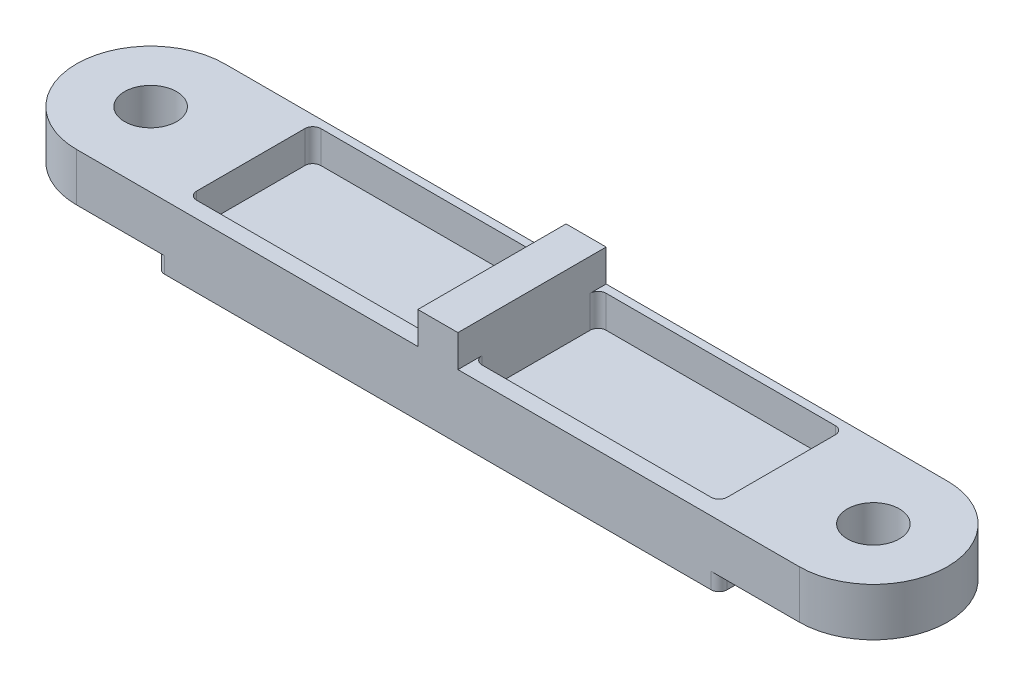
ISO-10303-21;
HEADER;
FILE_DESCRIPTION(('STEP AP214'),'2;1');
FILE_NAME('part.step','',(''),(''),'','','');
FILE_SCHEMA(('AUTOMOTIVE_DESIGN { 1 0 10303 214 1 1 1 1 }'));
ENDSEC;
DATA;
#1=APPLICATION_CONTEXT('core data for automotive mechanical design processes');
#2=APPLICATION_PROTOCOL_DEFINITION('international standard','automotive_design',2000,#1);
#3=PRODUCT_CONTEXT('',#1,'mechanical');
#4=PRODUCT('Part','Part','',(#3));
#5=PRODUCT_RELATED_PRODUCT_CATEGORY('part','',(#4));
#6=PRODUCT_DEFINITION_FORMATION('','',#4);
#7=PRODUCT_DEFINITION_CONTEXT('part definition',#1,'design');
#8=PRODUCT_DEFINITION('design','',#6,#7);
#9=PRODUCT_DEFINITION_SHAPE('','',#8);
#10=(LENGTH_UNIT() NAMED_UNIT(*) SI_UNIT(.MILLI.,.METRE.));
#11=(NAMED_UNIT(*) PLANE_ANGLE_UNIT() SI_UNIT($,.RADIAN.));
#12=(NAMED_UNIT(*) SI_UNIT($,.STERADIAN.) SOLID_ANGLE_UNIT());
#13=UNCERTAINTY_MEASURE_WITH_UNIT(LENGTH_MEASURE(1.E-05),#10,'distance_accuracy_value','');
#14=(GEOMETRIC_REPRESENTATION_CONTEXT(3) GLOBAL_UNCERTAINTY_ASSIGNED_CONTEXT((#13)) GLOBAL_UNIT_ASSIGNED_CONTEXT((#10,
#11,#12)) REPRESENTATION_CONTEXT('',''));
#15=CARTESIAN_POINT('',(0.,0.,0.));
#16=DIRECTION('',(0.,0.,1.));
#17=DIRECTION('',(1.,0.,0.));
#18=AXIS2_PLACEMENT_3D('',#15,#16,#17);
#19=CARTESIAN_POINT('',(0.,8.,0.));
#20=DIRECTION('',(0.,-1.,0.));
#21=DIRECTION('',(0.,0.,-1.));
#22=AXIS2_PLACEMENT_3D('',#19,#20,#21);
#23=PLANE('',#22);
#24=CARTESIAN_POINT('',(45.1,8.,0.));
#25=DIRECTION('',(0.,-1.,0.));
#26=DIRECTION('',(0.,0.,1.));
#27=AXIS2_PLACEMENT_3D('',#24,#25,#26);
#28=CIRCLE('',#27,3.25);
#29=CARTESIAN_POINT('',(45.1,8.,3.25000000000001));
#30=VERTEX_POINT('',#29);
#31=EDGE_CURVE('E291',#30,#30,#28,.T.);
#32=ORIENTED_EDGE('',*,*,#31,.T.);
#33=EDGE_LOOP('',(#32));
#34=FACE_BOUND('',#33,.T.);
#35=DIRECTION('',(0.,0.,-1.));
#36=VECTOR('',#35,1.);
#37=CARTESIAN_POINT('',(2.5,8.,0.));
#38=LINE('',#37,#36);
#39=CARTESIAN_POINT('',(2.5,8.,9.25));
#40=VERTEX_POINT('',#39);
#41=CARTESIAN_POINT('',(2.5,8.,6.25));
#42=VERTEX_POINT('',#41);
#43=EDGE_CURVE('E283',#40,#42,#38,.T.);
#44=ORIENTED_EDGE('',*,*,#43,.F.);
#45=DIRECTION('',(1.,0.,0.));
#46=VECTOR('',#45,1.);
#47=CARTESIAN_POINT('',(-35.1,8.,9.25));
#48=LINE('',#47,#46);
#49=CARTESIAN_POINT('',(45.1,8.,9.25));
#50=VERTEX_POINT('',#49);
#51=EDGE_CURVE('E368',#40,#50,#48,.T.);
#52=ORIENTED_EDGE('',*,*,#51,.T.);
#53=CARTESIAN_POINT('',(45.1,8.,0.));
#54=DIRECTION('',(0.,-1.,0.));
#55=DIRECTION('',(0.,0.,1.));
#56=AXIS2_PLACEMENT_3D('',#53,#54,#55);
#57=CIRCLE('',#56,9.25);
#58=CARTESIAN_POINT('',(45.1,8.,-9.24999999999999));
#59=VERTEX_POINT('',#58);
#60=EDGE_CURVE('E295',#59,#50,#57,.T.);
#61=ORIENTED_EDGE('',*,*,#60,.F.);
#62=DIRECTION('',(-1.,0.,0.));
#63=VECTOR('',#62,1.);
#64=CARTESIAN_POINT('',(-35.1,8.,-9.24999999999999));
#65=LINE('',#64,#63);
#66=CARTESIAN_POINT('',(2.5,8.,-9.25));
#67=VERTEX_POINT('',#66);
#68=EDGE_CURVE('E366',#59,#67,#65,.T.);
#69=ORIENTED_EDGE('',*,*,#68,.T.);
#70=CARTESIAN_POINT('',(2.5,8.,-7.25));
#71=VERTEX_POINT('',#70);
#72=EDGE_CURVE('E273',#71,#67,#38,.T.);
#73=ORIENTED_EDGE('',*,*,#72,.F.);
#74=CARTESIAN_POINT('',(3.5,8.,-7.25));
#75=DIRECTION('',(0.,-1.,0.));
#76=DIRECTION('',(0.,0.,-1.));
#77=AXIS2_PLACEMENT_3D('',#74,#75,#76);
#78=CIRCLE('',#77,1.);
#79=CARTESIAN_POINT('',(3.5,8.,-8.25));
#80=VERTEX_POINT('',#79);
#81=EDGE_CURVE('E463',#71,#80,#78,.T.);
#82=ORIENTED_EDGE('',*,*,#81,.T.);
#83=DIRECTION('',(-1.,0.,0.));
#84=VECTOR('',#83,1.);
#85=CARTESIAN_POINT('',(0.,8.,-8.25));
#86=LINE('',#85,#84);
#87=CARTESIAN_POINT('',(32.1,8.,-8.25));
#88=VERTEX_POINT('',#87);
#89=EDGE_CURVE('E327',#88,#80,#86,.T.);
#90=ORIENTED_EDGE('',*,*,#89,.F.);
#91=CARTESIAN_POINT('',(32.1,8.,-7.25));
#92=DIRECTION('',(0.,-1.,0.));
#93=DIRECTION('',(0.,0.,-1.));
#94=AXIS2_PLACEMENT_3D('',#91,#92,#93);
#95=CIRCLE('',#94,1.);
#96=CARTESIAN_POINT('',(33.1,8.,-7.25));
#97=VERTEX_POINT('',#96);
#98=EDGE_CURVE('E477',#88,#97,#95,.T.);
#99=ORIENTED_EDGE('',*,*,#98,.T.);
#100=DIRECTION('',(0.,0.,1.));
#101=VECTOR('',#100,1.);
#102=CARTESIAN_POINT('',(33.1,8.,7.25000000000001));
#103=LINE('',#102,#101);
#104=CARTESIAN_POINT('',(33.1,8.,6.25));
#105=VERTEX_POINT('',#104);
#106=EDGE_CURVE('E285',#97,#105,#103,.T.);
#107=ORIENTED_EDGE('',*,*,#106,.T.);
#108=CARTESIAN_POINT('',(32.1,8.,6.25));
#109=DIRECTION('',(0.,-1.,0.));
#110=DIRECTION('',(0.,0.,-1.));
#111=AXIS2_PLACEMENT_3D('',#108,#109,#110);
#112=CIRCLE('',#111,1.);
#113=CARTESIAN_POINT('',(32.1,8.,7.25));
#114=VERTEX_POINT('',#113);
#115=EDGE_CURVE('E479',#105,#114,#112,.T.);
#116=ORIENTED_EDGE('',*,*,#115,.T.);
#117=DIRECTION('',(1.,0.,0.));
#118=VECTOR('',#117,1.);
#119=CARTESIAN_POINT('',(0.,8.,7.25));
#120=LINE('',#119,#118);
#121=CARTESIAN_POINT('',(3.5,8.,7.25));
#122=VERTEX_POINT('',#121);
#123=EDGE_CURVE('E323',#122,#114,#120,.T.);
#124=ORIENTED_EDGE('',*,*,#123,.F.);
#125=CARTESIAN_POINT('',(3.5,8.,6.25));
#126=DIRECTION('',(0.,-1.,0.));
#127=DIRECTION('',(0.,0.,-1.));
#128=AXIS2_PLACEMENT_3D('',#125,#126,#127);
#129=CIRCLE('',#128,1.);
#130=EDGE_CURVE('E465',#122,#42,#129,.T.);
#131=ORIENTED_EDGE('',*,*,#130,.T.);
#132=EDGE_LOOP('',(#44,#52,#61,#69,#73,#82,#90,#99,#107,#116,#124,#131));
#133=FACE_BOUND('',#132,.T.);
#134=ADVANCED_FACE('F38',(#34,#133),#23,.F.);
#135=CARTESIAN_POINT('',(-45.1,8.,0.));
#136=DIRECTION('',(0.,1.,0.));
#137=DIRECTION('',(0.,0.,1.));
#138=AXIS2_PLACEMENT_3D('',#135,#136,#137);
#139=CIRCLE('',#138,3.25);
#140=CARTESIAN_POINT('',(-45.1,8.,3.25000000000001));
#141=VERTEX_POINT('',#140);
#142=EDGE_CURVE('E336',#141,#141,#139,.T.);
#143=ORIENTED_EDGE('',*,*,#142,.F.);
#144=EDGE_LOOP('',(#143));
#145=FACE_BOUND('',#144,.T.);
#146=DIRECTION('',(0.,0.,1.));
#147=VECTOR('',#146,1.);
#148=CARTESIAN_POINT('',(-2.5,8.,0.));
#149=LINE('',#148,#147);
#150=CARTESIAN_POINT('',(-2.5,8.,-9.25));
#151=VERTEX_POINT('',#150);
#152=CARTESIAN_POINT('',(-2.5,8.,-7.25));
#153=VERTEX_POINT('',#152);
#154=EDGE_CURVE('E277',#151,#153,#149,.T.);
#155=ORIENTED_EDGE('',*,*,#154,.F.);
#156=CARTESIAN_POINT('',(-45.1,8.,-9.24999999999999));
#157=VERTEX_POINT('',#156);
#158=EDGE_CURVE('E369',#151,#157,#65,.T.);
#159=ORIENTED_EDGE('',*,*,#158,.T.);
#160=CARTESIAN_POINT('',(-45.1,8.,0.));
#161=DIRECTION('',(0.,1.,0.));
#162=DIRECTION('',(0.,0.,1.));
#163=AXIS2_PLACEMENT_3D('',#160,#161,#162);
#164=CIRCLE('',#163,9.25);
#165=CARTESIAN_POINT('',(-45.1,8.,9.25));
#166=VERTEX_POINT('',#165);
#167=EDGE_CURVE('E344',#157,#166,#164,.T.);
#168=ORIENTED_EDGE('',*,*,#167,.T.);
#169=CARTESIAN_POINT('',(-2.5,8.,9.25));
#170=VERTEX_POINT('',#169);
#171=EDGE_CURVE('E370',#166,#170,#48,.T.);
#172=ORIENTED_EDGE('',*,*,#171,.T.);
#173=CARTESIAN_POINT('',(-2.5,8.,6.25));
#174=VERTEX_POINT('',#173);
#175=EDGE_CURVE('E274',#174,#170,#149,.T.);
#176=ORIENTED_EDGE('',*,*,#175,.F.);
#177=CARTESIAN_POINT('',(-3.5,8.,6.25));
#178=DIRECTION('',(0.,-1.,0.));
#179=DIRECTION('',(0.,0.,-1.));
#180=AXIS2_PLACEMENT_3D('',#177,#178,#179);
#181=CIRCLE('',#180,1.);
#182=CARTESIAN_POINT('',(-3.5,8.,7.25));
#183=VERTEX_POINT('',#182);
#184=EDGE_CURVE('E468',#174,#183,#181,.T.);
#185=ORIENTED_EDGE('',*,*,#184,.T.);
#186=CARTESIAN_POINT('',(-32.1,8.,7.25000000000001));
#187=VERTEX_POINT('',#186);
#188=EDGE_CURVE('E319',#187,#183,#120,.T.);
#189=ORIENTED_EDGE('',*,*,#188,.F.);
#190=CARTESIAN_POINT('',(-32.1,8.,6.25000000000001));
#191=DIRECTION('',(0.,-1.,0.));
#192=DIRECTION('',(0.,0.,-1.));
#193=AXIS2_PLACEMENT_3D('',#190,#191,#192);
#194=CIRCLE('',#193,1.);
#195=CARTESIAN_POINT('',(-33.1,8.,6.25000000000001));
#196=VERTEX_POINT('',#195);
#197=EDGE_CURVE('E473',#187,#196,#194,.T.);
#198=ORIENTED_EDGE('',*,*,#197,.T.);
#199=DIRECTION('',(0.,0.,1.));
#200=VECTOR('',#199,1.);
#201=CARTESIAN_POINT('',(-33.1,8.,7.25000000000001));
#202=LINE('',#201,#200);
#203=CARTESIAN_POINT('',(-33.1,8.,-7.25));
#204=VERTEX_POINT('',#203);
#205=EDGE_CURVE('E324',#204,#196,#202,.T.);
#206=ORIENTED_EDGE('',*,*,#205,.F.);
#207=CARTESIAN_POINT('',(-32.1,8.,-7.25));
#208=DIRECTION('',(0.,-1.,0.));
#209=DIRECTION('',(0.,0.,-1.));
#210=AXIS2_PLACEMENT_3D('',#207,#208,#209);
#211=CIRCLE('',#210,1.);
#212=CARTESIAN_POINT('',(-32.1,8.,-8.25));
#213=VERTEX_POINT('',#212);
#214=EDGE_CURVE('E475',#204,#213,#211,.T.);
#215=ORIENTED_EDGE('',*,*,#214,.T.);
#216=CARTESIAN_POINT('',(-3.5,8.,-8.25));
#217=VERTEX_POINT('',#216);
#218=EDGE_CURVE('E318',#217,#213,#86,.T.);
#219=ORIENTED_EDGE('',*,*,#218,.F.);
#220=CARTESIAN_POINT('',(-3.5,8.,-7.25));
#221=DIRECTION('',(0.,-1.,0.));
#222=DIRECTION('',(0.,0.,-1.));
#223=AXIS2_PLACEMENT_3D('',#220,#221,#222);
#224=CIRCLE('',#223,1.);
#225=EDGE_CURVE('E470',#217,#153,#224,.T.);
#226=ORIENTED_EDGE('',*,*,#225,.T.);
#227=EDGE_LOOP('',(#155,#159,#168,#172,#176,#185,#189,#198,#206,#215,#219,#226));
#228=FACE_BOUND('',#227,.T.);
#229=ADVANCED_FACE('F532',(#145,#228),#23,.F.);
#230=CARTESIAN_POINT('',(0.,4.,0.));
#231=DIRECTION('',(0.,-1.,0.));
#232=DIRECTION('',(0.,0.,-1.));
#233=AXIS2_PLACEMENT_3D('',#230,#231,#232);
#234=PLANE('',#233);
#235=DIRECTION('',(-1.,0.,0.));
#236=VECTOR('',#235,1.);
#237=CARTESIAN_POINT('',(0.,4.,-8.25));
#238=LINE('',#237,#236);
#239=CARTESIAN_POINT('',(32.1,4.,-8.25));
#240=VERTEX_POINT('',#239);
#241=CARTESIAN_POINT('',(3.5,4.,-8.25));
#242=VERTEX_POINT('',#241);
#243=EDGE_CURVE('E332',#240,#242,#238,.T.);
#244=ORIENTED_EDGE('',*,*,#243,.T.);
#245=CARTESIAN_POINT('',(3.5,4.,-7.25));
#246=DIRECTION('',(0.,-1.,0.));
#247=DIRECTION('',(0.,0.,-1.));
#248=AXIS2_PLACEMENT_3D('',#245,#246,#247);
#249=CIRCLE('',#248,1.);
#250=CARTESIAN_POINT('',(2.5,4.,-7.25));
#251=VERTEX_POINT('',#250);
#252=EDGE_CURVE('E396',#242,#251,#249,.F.);
#253=ORIENTED_EDGE('',*,*,#252,.T.);
#254=DIRECTION('',(0.,0.,-1.));
#255=VECTOR('',#254,1.);
#256=CARTESIAN_POINT('',(2.5,4.,9.25));
#257=LINE('',#256,#255);
#258=CARTESIAN_POINT('',(2.5,4.,6.25));
#259=VERTEX_POINT('',#258);
#260=EDGE_CURVE('E566',#259,#251,#257,.T.);
#261=ORIENTED_EDGE('',*,*,#260,.F.);
#262=CARTESIAN_POINT('',(3.5,4.,6.25));
#263=DIRECTION('',(0.,-1.,0.));
#264=DIRECTION('',(0.,0.,-1.));
#265=AXIS2_PLACEMENT_3D('',#262,#263,#264);
#266=CIRCLE('',#265,1.);
#267=CARTESIAN_POINT('',(3.5,4.,7.25));
#268=VERTEX_POINT('',#267);
#269=EDGE_CURVE('E394',#259,#268,#266,.F.);
#270=ORIENTED_EDGE('',*,*,#269,.T.);
#271=DIRECTION('',(1.,0.,0.));
#272=VECTOR('',#271,1.);
#273=CARTESIAN_POINT('',(0.,4.,7.25));
#274=LINE('',#273,#272);
#275=CARTESIAN_POINT('',(32.1,4.,7.25));
#276=VERTEX_POINT('',#275);
#277=EDGE_CURVE('E337',#268,#276,#274,.T.);
#278=ORIENTED_EDGE('',*,*,#277,.T.);
#279=CARTESIAN_POINT('',(32.1,4.,6.25));
#280=DIRECTION('',(0.,-1.,0.));
#281=DIRECTION('',(0.,0.,-1.));
#282=AXIS2_PLACEMENT_3D('',#279,#280,#281);
#283=CIRCLE('',#282,1.);
#284=CARTESIAN_POINT('',(33.1,4.,6.25));
#285=VERTEX_POINT('',#284);
#286=EDGE_CURVE('E390',#276,#285,#283,.F.);
#287=ORIENTED_EDGE('',*,*,#286,.T.);
#288=DIRECTION('',(0.,0.,1.));
#289=VECTOR('',#288,1.);
#290=CARTESIAN_POINT('',(33.1,4.,7.25000000000001));
#291=LINE('',#290,#289);
#292=CARTESIAN_POINT('',(33.1,4.,-7.25));
#293=VERTEX_POINT('',#292);
#294=EDGE_CURVE('E288',#293,#285,#291,.T.);
#295=ORIENTED_EDGE('',*,*,#294,.F.);
#296=CARTESIAN_POINT('',(32.1,4.,-7.25));
#297=DIRECTION('',(0.,-1.,0.));
#298=DIRECTION('',(0.,0.,-1.));
#299=AXIS2_PLACEMENT_3D('',#296,#297,#298);
#300=CIRCLE('',#299,1.);
#301=EDGE_CURVE('E392',#293,#240,#300,.F.);
#302=ORIENTED_EDGE('',*,*,#301,.T.);
#303=EDGE_LOOP('',(#244,#253,#261,#270,#278,#287,#295,#302));
#304=FACE_BOUND('',#303,.T.);
#305=ADVANCED_FACE('F538',(#304),#234,.F.);
#306=CARTESIAN_POINT('',(-32.1,4.,7.25000000000001));
#307=VERTEX_POINT('',#306);
#308=CARTESIAN_POINT('',(-3.5,4.,7.25));
#309=VERTEX_POINT('',#308);
#310=EDGE_CURVE('E333',#307,#309,#274,.T.);
#311=ORIENTED_EDGE('',*,*,#310,.T.);
#312=CARTESIAN_POINT('',(-3.5,4.,6.25));
#313=DIRECTION('',(0.,-1.,0.));
#314=DIRECTION('',(0.,0.,-1.));
#315=AXIS2_PLACEMENT_3D('',#312,#313,#314);
#316=CIRCLE('',#315,1.);
#317=CARTESIAN_POINT('',(-2.5,4.,6.25));
#318=VERTEX_POINT('',#317);
#319=EDGE_CURVE('E419',#309,#318,#316,.F.);
#320=ORIENTED_EDGE('',*,*,#319,.T.);
#321=DIRECTION('',(0.,0.,1.));
#322=VECTOR('',#321,1.);
#323=CARTESIAN_POINT('',(-2.5,4.,9.25));
#324=LINE('',#323,#322);
#325=CARTESIAN_POINT('',(-2.5,4.,-7.25));
#326=VERTEX_POINT('',#325);
#327=EDGE_CURVE('E267',#326,#318,#324,.T.);
#328=ORIENTED_EDGE('',*,*,#327,.F.);
#329=CARTESIAN_POINT('',(-3.5,4.,-7.25));
#330=DIRECTION('',(0.,-1.,0.));
#331=DIRECTION('',(0.,0.,-1.));
#332=AXIS2_PLACEMENT_3D('',#329,#330,#331);
#333=CIRCLE('',#332,1.);
#334=CARTESIAN_POINT('',(-3.5,4.,-8.25));
#335=VERTEX_POINT('',#334);
#336=EDGE_CURVE('E417',#326,#335,#333,.F.);
#337=ORIENTED_EDGE('',*,*,#336,.T.);
#338=CARTESIAN_POINT('',(-32.1,4.,-8.25));
#339=VERTEX_POINT('',#338);
#340=EDGE_CURVE('E322',#335,#339,#238,.T.);
#341=ORIENTED_EDGE('',*,*,#340,.T.);
#342=CARTESIAN_POINT('',(-32.1,4.,-7.25));
#343=DIRECTION('',(0.,-1.,0.));
#344=DIRECTION('',(0.,0.,-1.));
#345=AXIS2_PLACEMENT_3D('',#342,#343,#344);
#346=CIRCLE('',#345,1.);
#347=CARTESIAN_POINT('',(-33.1,4.,-7.25));
#348=VERTEX_POINT('',#347);
#349=EDGE_CURVE('E413',#339,#348,#346,.F.);
#350=ORIENTED_EDGE('',*,*,#349,.T.);
#351=DIRECTION('',(0.,0.,1.));
#352=VECTOR('',#351,1.);
#353=CARTESIAN_POINT('',(-33.1,4.,7.25000000000001));
#354=LINE('',#353,#352);
#355=CARTESIAN_POINT('',(-33.1,4.,6.25000000000001));
#356=VERTEX_POINT('',#355);
#357=EDGE_CURVE('E338',#348,#356,#354,.T.);
#358=ORIENTED_EDGE('',*,*,#357,.T.);
#359=CARTESIAN_POINT('',(-32.1,4.,6.25000000000001));
#360=DIRECTION('',(0.,-1.,0.));
#361=DIRECTION('',(0.,0.,-1.));
#362=AXIS2_PLACEMENT_3D('',#359,#360,#361);
#363=CIRCLE('',#362,1.);
#364=EDGE_CURVE('E415',#356,#307,#363,.F.);
#365=ORIENTED_EDGE('',*,*,#364,.T.);
#366=EDGE_LOOP('',(#311,#320,#328,#337,#341,#350,#358,#365));
#367=FACE_BOUND('',#366,.T.);
#368=ADVANCED_FACE('F634',(#367),#234,.F.);
#369=CARTESIAN_POINT('',(0.,-36.549418600027,-8.25));
#370=DIRECTION('',(0.,0.,-1.));
#371=DIRECTION('',(-1.,0.,0.));
#372=AXIS2_PLACEMENT_3D('',#369,#370,#371);
#373=PLANE('',#372);
#374=ORIENTED_EDGE('',*,*,#89,.T.);
#375=DIRECTION('',(0.,1.,0.));
#376=VECTOR('',#375,1.);
#377=CARTESIAN_POINT('',(3.5,4.,-8.25));
#378=LINE('',#377,#376);
#379=EDGE_CURVE('E388',#80,#242,#378,.F.);
#380=ORIENTED_EDGE('',*,*,#379,.T.);
#381=ORIENTED_EDGE('',*,*,#243,.F.);
#382=DIRECTION('',(0.,1.,0.));
#383=VECTOR('',#382,1.);
#384=CARTESIAN_POINT('',(32.1,8.,-8.25));
#385=LINE('',#384,#383);
#386=EDGE_CURVE('E385',#240,#88,#385,.T.);
#387=ORIENTED_EDGE('',*,*,#386,.T.);
#388=EDGE_LOOP('',(#374,#380,#381,#387));
#389=FACE_BOUND('',#388,.T.);
#390=ADVANCED_FACE('F602',(#389),#373,.F.);
#391=ORIENTED_EDGE('',*,*,#340,.F.);
#392=DIRECTION('',(0.,-1.,0.));
#393=VECTOR('',#392,1.);
#394=CARTESIAN_POINT('',(-3.5,8.,-8.25));
#395=LINE('',#394,#393);
#396=EDGE_CURVE('E423',#335,#217,#395,.F.);
#397=ORIENTED_EDGE('',*,*,#396,.T.);
#398=ORIENTED_EDGE('',*,*,#218,.T.);
#399=DIRECTION('',(0.,1.,0.));
#400=VECTOR('',#399,1.);
#401=CARTESIAN_POINT('',(-32.1,4.,-8.25));
#402=LINE('',#401,#400);
#403=EDGE_CURVE('E421',#213,#339,#402,.F.);
#404=ORIENTED_EDGE('',*,*,#403,.T.);
#405=EDGE_LOOP('',(#391,#397,#398,#404));
#406=FACE_BOUND('',#405,.T.);
#407=ADVANCED_FACE('F628',(#406),#373,.F.);
#408=CARTESIAN_POINT('',(0.,-36.549418600027,7.25));
#409=DIRECTION('',(0.,0.,1.));
#410=DIRECTION('',(1.,0.,0.));
#411=AXIS2_PLACEMENT_3D('',#408,#409,#410);
#412=PLANE('',#411);
#413=ORIENTED_EDGE('',*,*,#277,.F.);
#414=DIRECTION('',(0.,-1.,0.));
#415=VECTOR('',#414,1.);
#416=CARTESIAN_POINT('',(3.5,8.,7.25));
#417=LINE('',#416,#415);
#418=EDGE_CURVE('E400',#268,#122,#417,.F.);
#419=ORIENTED_EDGE('',*,*,#418,.T.);
#420=ORIENTED_EDGE('',*,*,#123,.T.);
#421=DIRECTION('',(0.,1.,0.));
#422=VECTOR('',#421,1.);
#423=CARTESIAN_POINT('',(32.1,4.,7.25));
#424=LINE('',#423,#422);
#425=EDGE_CURVE('E398',#114,#276,#424,.F.);
#426=ORIENTED_EDGE('',*,*,#425,.T.);
#427=EDGE_LOOP('',(#413,#419,#420,#426));
#428=FACE_BOUND('',#427,.T.);
#429=ADVANCED_FACE('F584',(#428),#412,.F.);
#430=ORIENTED_EDGE('',*,*,#188,.T.);
#431=DIRECTION('',(0.,1.,0.));
#432=VECTOR('',#431,1.);
#433=CARTESIAN_POINT('',(-3.5,4.,7.25));
#434=LINE('',#433,#432);
#435=EDGE_CURVE('E411',#183,#309,#434,.F.);
#436=ORIENTED_EDGE('',*,*,#435,.T.);
#437=ORIENTED_EDGE('',*,*,#310,.F.);
#438=DIRECTION('',(0.,1.,0.));
#439=VECTOR('',#438,1.);
#440=CARTESIAN_POINT('',(-32.1,8.,7.25000000000001));
#441=LINE('',#440,#439);
#442=EDGE_CURVE('E408',#307,#187,#441,.T.);
#443=ORIENTED_EDGE('',*,*,#442,.T.);
#444=EDGE_LOOP('',(#430,#436,#437,#443));
#445=FACE_BOUND('',#444,.T.);
#446=ADVANCED_FACE('F529',(#445),#412,.F.);
#447=CARTESIAN_POINT('',(-35.1,8.,-9.24999999999999));
#448=DIRECTION('',(0.,0.,1.));
#449=DIRECTION('',(1.,0.,0.));
#450=AXIS2_PLACEMENT_3D('',#447,#448,#449);
#451=PLANE('',#450);
#452=DIRECTION('',(1.,0.,0.));
#453=VECTOR('',#452,1.);
#454=CARTESIAN_POINT('',(35.1,2.,-9.24999999999999));
#455=LINE('',#454,#453);
#456=CARTESIAN_POINT('',(34.1,2.,-9.24999999999999));
#457=VERTEX_POINT('',#456);
#458=CARTESIAN_POINT('',(45.1,2.,-9.24999999999999));
#459=VERTEX_POINT('',#458);
#460=EDGE_CURVE('E301',#457,#459,#455,.T.);
#461=ORIENTED_EDGE('',*,*,#460,.F.);
#462=DIRECTION('',(0.,-1.,0.));
#463=VECTOR('',#462,1.);
#464=CARTESIAN_POINT('',(34.1,8.,-9.25000000000001));
#465=LINE('',#464,#463);
#466=CARTESIAN_POINT('',(34.1,0.,-9.25000000000001));
#467=VERTEX_POINT('',#466);
#468=EDGE_CURVE('E438',#457,#467,#465,.T.);
#469=ORIENTED_EDGE('',*,*,#468,.T.);
#470=DIRECTION('',(-1.,0.,0.));
#471=VECTOR('',#470,1.);
#472=CARTESIAN_POINT('',(-35.1,0.,-9.24999999999999));
#473=LINE('',#472,#471);
#474=CARTESIAN_POINT('',(-34.1,0.,-9.24999999999999));
#475=VERTEX_POINT('',#474);
#476=EDGE_CURVE('E363',#467,#475,#473,.T.);
#477=ORIENTED_EDGE('',*,*,#476,.T.);
#478=DIRECTION('',(0.,-1.,0.));
#479=VECTOR('',#478,1.);
#480=CARTESIAN_POINT('',(-34.1,8.,-9.24999999999999));
#481=LINE('',#480,#479);
#482=CARTESIAN_POINT('',(-34.1,2.,-9.24999999999999));
#483=VERTEX_POINT('',#482);
#484=EDGE_CURVE('E435',#475,#483,#481,.F.);
#485=ORIENTED_EDGE('',*,*,#484,.T.);
#486=DIRECTION('',(-1.,0.,0.));
#487=VECTOR('',#486,1.);
#488=CARTESIAN_POINT('',(-35.1,2.,-9.24999999999999));
#489=LINE('',#488,#487);
#490=CARTESIAN_POINT('',(-45.1,2.,-9.24999999999999));
#491=VERTEX_POINT('',#490);
#492=EDGE_CURVE('E350',#483,#491,#489,.T.);
#493=ORIENTED_EDGE('',*,*,#492,.T.);
#494=DIRECTION('',(0.,1.,0.));
#495=VECTOR('',#494,1.);
#496=CARTESIAN_POINT('',(-45.1,2.,-9.24999999999999));
#497=LINE('',#496,#495);
#498=EDGE_CURVE('E357',#491,#157,#497,.T.);
#499=ORIENTED_EDGE('',*,*,#498,.T.);
#500=ORIENTED_EDGE('',*,*,#158,.F.);
#501=DIRECTION('',(0.,-1.,0.));
#502=VECTOR('',#501,1.);
#503=CARTESIAN_POINT('',(-2.5,12.,-9.24999999999999));
#504=LINE('',#503,#502);
#505=CARTESIAN_POINT('',(-2.5,12.,-9.24999999999999));
#506=VERTEX_POINT('',#505);
#507=EDGE_CURVE('E254',#506,#151,#504,.T.);
#508=ORIENTED_EDGE('',*,*,#507,.F.);
#509=DIRECTION('',(-1.,0.,0.));
#510=VECTOR('',#509,1.);
#511=CARTESIAN_POINT('',(2.5,12.,-9.24999999999999));
#512=LINE('',#511,#510);
#513=CARTESIAN_POINT('',(2.5,12.,-9.24999999999999));
#514=VERTEX_POINT('',#513);
#515=EDGE_CURVE('E247',#514,#506,#512,.T.);
#516=ORIENTED_EDGE('',*,*,#515,.F.);
#517=DIRECTION('',(0.,-1.,0.));
#518=VECTOR('',#517,1.);
#519=CARTESIAN_POINT('',(2.5,12.,-9.24999999999999));
#520=LINE('',#519,#518);
#521=EDGE_CURVE('E251',#514,#67,#520,.T.);
#522=ORIENTED_EDGE('',*,*,#521,.T.);
#523=ORIENTED_EDGE('',*,*,#68,.F.);
#524=DIRECTION('',(0.,1.,0.));
#525=VECTOR('',#524,1.);
#526=CARTESIAN_POINT('',(45.1,2.,-9.24999999999999));
#527=LINE('',#526,#525);
#528=EDGE_CURVE('E307',#459,#59,#527,.T.);
#529=ORIENTED_EDGE('',*,*,#528,.F.);
#530=EDGE_LOOP('',(#461,#469,#477,#485,#493,#499,#500,#508,#516,#522,#523,#529));
#531=FACE_BOUND('',#530,.T.);
#532=ADVANCED_FACE('F249',(#531),#451,.F.);
#533=CARTESIAN_POINT('',(-35.1,8.,9.25));
#534=DIRECTION('',(1.,0.,0.));
#535=DIRECTION('',(0.,0.,-1.));
#536=AXIS2_PLACEMENT_3D('',#533,#534,#535);
#537=PLANE('',#536);
#538=DIRECTION('',(0.,0.,-1.));
#539=VECTOR('',#538,1.);
#540=CARTESIAN_POINT('',(-35.1,2.,-9.24999999999999));
#541=LINE('',#540,#539);
#542=CARTESIAN_POINT('',(-35.1,2.,8.25));
#543=VERTEX_POINT('',#542);
#544=CARTESIAN_POINT('',(-35.1,2.,-8.24999999999999));
#545=VERTEX_POINT('',#544);
#546=EDGE_CURVE('E347',#543,#545,#541,.T.);
#547=ORIENTED_EDGE('',*,*,#546,.T.);
#548=DIRECTION('',(0.,-1.,0.));
#549=VECTOR('',#548,1.);
#550=CARTESIAN_POINT('',(-35.1,8.,-8.24999999999999));
#551=LINE('',#550,#549);
#552=CARTESIAN_POINT('',(-35.1,0.,-8.24999999999999));
#553=VERTEX_POINT('',#552);
#554=EDGE_CURVE('E456',#545,#553,#551,.T.);
#555=ORIENTED_EDGE('',*,*,#554,.T.);
#556=DIRECTION('',(0.,0.,1.));
#557=VECTOR('',#556,1.);
#558=CARTESIAN_POINT('',(-35.1,0.,9.25));
#559=LINE('',#558,#557);
#560=CARTESIAN_POINT('',(-35.1,0.,8.25));
#561=VERTEX_POINT('',#560);
#562=EDGE_CURVE('E375',#553,#561,#559,.T.);
#563=ORIENTED_EDGE('',*,*,#562,.T.);
#564=DIRECTION('',(0.,-1.,0.));
#565=VECTOR('',#564,1.);
#566=CARTESIAN_POINT('',(-35.1,8.,8.25));
#567=LINE('',#566,#565);
#568=EDGE_CURVE('E454',#561,#543,#567,.F.);
#569=ORIENTED_EDGE('',*,*,#568,.T.);
#570=EDGE_LOOP('',(#547,#555,#563,#569));
#571=FACE_BOUND('',#570,.T.);
#572=ADVANCED_FACE('F521',(#571),#537,.F.);
#573=CARTESIAN_POINT('',(-35.1,8.,9.25));
#574=DIRECTION('',(0.,0.,-1.));
#575=DIRECTION('',(-1.,0.,0.));
#576=AXIS2_PLACEMENT_3D('',#573,#574,#575);
#577=PLANE('',#576);
#578=DIRECTION('',(1.,0.,0.));
#579=VECTOR('',#578,1.);
#580=CARTESIAN_POINT('',(-35.1,2.,9.25));
#581=LINE('',#580,#579);
#582=CARTESIAN_POINT('',(-45.1,2.,9.25));
#583=VERTEX_POINT('',#582);
#584=CARTESIAN_POINT('',(-34.1,2.,9.25));
#585=VERTEX_POINT('',#584);
#586=EDGE_CURVE('E53',#583,#585,#581,.T.);
#587=ORIENTED_EDGE('',*,*,#586,.T.);
#588=DIRECTION('',(0.,-1.,0.));
#589=VECTOR('',#588,1.);
#590=CARTESIAN_POINT('',(-34.1,8.,9.25));
#591=LINE('',#590,#589);
#592=CARTESIAN_POINT('',(-34.1,0.,9.25));
#593=VERTEX_POINT('',#592);
#594=EDGE_CURVE('E461',#585,#593,#591,.T.);
#595=ORIENTED_EDGE('',*,*,#594,.T.);
#596=DIRECTION('',(1.,0.,0.));
#597=VECTOR('',#596,1.);
#598=CARTESIAN_POINT('',(-35.1,0.,9.25));
#599=LINE('',#598,#597);
#600=CARTESIAN_POINT('',(34.1,0.,9.25));
#601=VERTEX_POINT('',#600);
#602=EDGE_CURVE('E378',#593,#601,#599,.T.);
#603=ORIENTED_EDGE('',*,*,#602,.T.);
#604=DIRECTION('',(0.,-1.,0.));
#605=VECTOR('',#604,1.);
#606=CARTESIAN_POINT('',(34.1,8.,9.25));
#607=LINE('',#606,#605);
#608=CARTESIAN_POINT('',(34.1,2.,9.25));
#609=VERTEX_POINT('',#608);
#610=EDGE_CURVE('E459',#601,#609,#607,.F.);
#611=ORIENTED_EDGE('',*,*,#610,.T.);
#612=DIRECTION('',(-1.,0.,0.));
#613=VECTOR('',#612,1.);
#614=CARTESIAN_POINT('',(35.1,2.,9.25));
#615=LINE('',#614,#613);
#616=CARTESIAN_POINT('',(45.1,2.,9.25));
#617=VERTEX_POINT('',#616);
#618=EDGE_CURVE('E60',#617,#609,#615,.T.);
#619=ORIENTED_EDGE('',*,*,#618,.F.);
#620=DIRECTION('',(0.,1.,0.));
#621=VECTOR('',#620,1.);
#622=CARTESIAN_POINT('',(45.1,2.,9.25));
#623=LINE('',#622,#621);
#624=EDGE_CURVE('E310',#617,#50,#623,.T.);
#625=ORIENTED_EDGE('',*,*,#624,.T.);
#626=ORIENTED_EDGE('',*,*,#51,.F.);
#627=DIRECTION('',(0.,-1.,0.));
#628=VECTOR('',#627,1.);
#629=CARTESIAN_POINT('',(2.5,12.,9.25));
#630=LINE('',#629,#628);
#631=CARTESIAN_POINT('',(2.5,12.,9.25));
#632=VERTEX_POINT('',#631);
#633=EDGE_CURVE('E563',#632,#40,#630,.T.);
#634=ORIENTED_EDGE('',*,*,#633,.F.);
#635=DIRECTION('',(1.,0.,0.));
#636=VECTOR('',#635,1.);
#637=CARTESIAN_POINT('',(2.5,12.,9.25));
#638=LINE('',#637,#636);
#639=CARTESIAN_POINT('',(-2.5,12.,9.25));
#640=VERTEX_POINT('',#639);
#641=EDGE_CURVE('E263',#640,#632,#638,.T.);
#642=ORIENTED_EDGE('',*,*,#641,.F.);
#643=DIRECTION('',(0.,-1.,0.));
#644=VECTOR('',#643,1.);
#645=CARTESIAN_POINT('',(-2.5,12.,9.25));
#646=LINE('',#645,#644);
#647=EDGE_CURVE('E279',#640,#170,#646,.T.);
#648=ORIENTED_EDGE('',*,*,#647,.T.);
#649=ORIENTED_EDGE('',*,*,#171,.F.);
#650=DIRECTION('',(0.,1.,0.));
#651=VECTOR('',#650,1.);
#652=CARTESIAN_POINT('',(-45.1,2.,9.25));
#653=LINE('',#652,#651);
#654=EDGE_CURVE('E360',#583,#166,#653,.T.);
#655=ORIENTED_EDGE('',*,*,#654,.F.);
#656=EDGE_LOOP('',(#587,#595,#603,#611,#619,#625,#626,#634,#642,#648,#649,#655));
#657=FACE_BOUND('',#656,.T.);
#658=ADVANCED_FACE('F495',(#657),#577,.F.);
#659=CARTESIAN_POINT('',(0.,0.,0.));
#660=DIRECTION('',(0.,-1.,0.));
#661=DIRECTION('',(0.,0.,-1.));
#662=AXIS2_PLACEMENT_3D('',#659,#660,#661);
#663=PLANE('',#662);
#664=ORIENTED_EDGE('',*,*,#476,.F.);
#665=CARTESIAN_POINT('',(34.1,0.,-8.25000000000001));
#666=DIRECTION('',(0.,-1.,0.));
#667=DIRECTION('',(0.,0.,-1.));
#668=AXIS2_PLACEMENT_3D('',#665,#666,#667);
#669=CIRCLE('',#668,1.);
#670=CARTESIAN_POINT('',(35.1,0.,-8.25000000000001));
#671=VERTEX_POINT('',#670);
#672=EDGE_CURVE('E447',#467,#671,#669,.T.);
#673=ORIENTED_EDGE('',*,*,#672,.T.);
#674=DIRECTION('',(0.,0.,1.));
#675=VECTOR('',#674,1.);
#676=CARTESIAN_POINT('',(35.1,0.,9.25));
#677=LINE('',#676,#675);
#678=CARTESIAN_POINT('',(35.1,0.,8.25));
#679=VERTEX_POINT('',#678);
#680=EDGE_CURVE('E313',#671,#679,#677,.T.);
#681=ORIENTED_EDGE('',*,*,#680,.T.);
#682=CARTESIAN_POINT('',(34.1,0.,8.25));
#683=DIRECTION('',(0.,-1.,0.));
#684=DIRECTION('',(0.,0.,-1.));
#685=AXIS2_PLACEMENT_3D('',#682,#683,#684);
#686=CIRCLE('',#685,1.);
#687=EDGE_CURVE('E441',#679,#601,#686,.T.);
#688=ORIENTED_EDGE('',*,*,#687,.T.);
#689=ORIENTED_EDGE('',*,*,#602,.F.);
#690=CARTESIAN_POINT('',(-34.1,0.,8.25));
#691=DIRECTION('',(0.,-1.,0.));
#692=DIRECTION('',(0.,0.,-1.));
#693=AXIS2_PLACEMENT_3D('',#690,#691,#692);
#694=CIRCLE('',#693,1.);
#695=EDGE_CURVE('E443',#593,#561,#694,.T.);
#696=ORIENTED_EDGE('',*,*,#695,.T.);
#697=ORIENTED_EDGE('',*,*,#562,.F.);
#698=CARTESIAN_POINT('',(-34.1,0.,-8.24999999999999));
#699=DIRECTION('',(0.,-1.,0.));
#700=DIRECTION('',(0.,0.,-1.));
#701=AXIS2_PLACEMENT_3D('',#698,#699,#700);
#702=CIRCLE('',#701,1.);
#703=EDGE_CURVE('E445',#553,#475,#702,.T.);
#704=ORIENTED_EDGE('',*,*,#703,.T.);
#705=EDGE_LOOP('',(#664,#673,#681,#688,#689,#696,#697,#704));
#706=FACE_BOUND('',#705,.T.);
#707=ADVANCED_FACE('F499',(#706),#663,.T.);
#708=CARTESIAN_POINT('',(-45.1,2.,0.));
#709=DIRECTION('',(0.,1.,0.));
#710=DIRECTION('',(0.,0.,1.));
#711=AXIS2_PLACEMENT_3D('',#708,#709,#710);
#712=CYLINDRICAL_SURFACE('',#711,9.25);
#713=ORIENTED_EDGE('',*,*,#167,.F.);
#714=ORIENTED_EDGE('',*,*,#498,.F.);
#715=CARTESIAN_POINT('',(-45.1,2.,0.));
#716=DIRECTION('',(0.,1.,0.));
#717=DIRECTION('',(0.,0.,1.));
#718=AXIS2_PLACEMENT_3D('',#715,#716,#717);
#719=CIRCLE('',#718,9.25);
#720=EDGE_CURVE('E353',#491,#583,#719,.T.);
#721=ORIENTED_EDGE('',*,*,#720,.T.);
#722=ORIENTED_EDGE('',*,*,#654,.T.);
#723=EDGE_LOOP('',(#713,#714,#721,#722));
#724=FACE_BOUND('',#723,.T.);
#725=ADVANCED_FACE('F543',(#724),#712,.T.);
#726=CARTESIAN_POINT('',(-45.1,2.,0.));
#727=DIRECTION('',(0.,1.,0.));
#728=DIRECTION('',(0.,0.,1.));
#729=AXIS2_PLACEMENT_3D('',#726,#727,#728);
#730=PLANE('',#729);
#731=CARTESIAN_POINT('',(-45.1,2.,0.));
#732=DIRECTION('',(0.,1.,0.));
#733=DIRECTION('',(0.,0.,1.));
#734=AXIS2_PLACEMENT_3D('',#731,#732,#733);
#735=CIRCLE('',#734,3.25);
#736=CARTESIAN_POINT('',(-45.1,2.,3.25000000000001));
#737=VERTEX_POINT('',#736);
#738=EDGE_CURVE('E341',#737,#737,#735,.T.);
#739=ORIENTED_EDGE('',*,*,#738,.T.);
#740=EDGE_LOOP('',(#739));
#741=FACE_BOUND('',#740,.T.);
#742=ORIENTED_EDGE('',*,*,#546,.F.);
#743=CARTESIAN_POINT('',(-34.1,2.,8.25));
#744=DIRECTION('',(0.,1.,0.));
#745=DIRECTION('',(0.,0.,1.));
#746=AXIS2_PLACEMENT_3D('',#743,#744,#745);
#747=CIRCLE('',#746,1.);
#748=EDGE_CURVE('E46',#543,#585,#747,.T.);
#749=ORIENTED_EDGE('',*,*,#748,.T.);
#750=ORIENTED_EDGE('',*,*,#586,.F.);
#751=ORIENTED_EDGE('',*,*,#720,.F.);
#752=ORIENTED_EDGE('',*,*,#492,.F.);
#753=CARTESIAN_POINT('',(-34.1,2.,-8.24999999999999));
#754=DIRECTION('',(0.,1.,0.));
#755=DIRECTION('',(0.,0.,1.));
#756=AXIS2_PLACEMENT_3D('',#753,#754,#755);
#757=CIRCLE('',#756,1.);
#758=EDGE_CURVE('E484',#483,#545,#757,.T.);
#759=ORIENTED_EDGE('',*,*,#758,.T.);
#760=EDGE_LOOP('',(#742,#749,#750,#751,#752,#759));
#761=FACE_BOUND('',#760,.T.);
#762=ADVANCED_FACE('F489',(#741,#761),#730,.F.);
#763=CARTESIAN_POINT('',(-45.1,2.,0.));
#764=DIRECTION('',(0.,1.,0.));
#765=DIRECTION('',(0.,0.,1.));
#766=AXIS2_PLACEMENT_3D('',#763,#764,#765);
#767=CYLINDRICAL_SURFACE('',#766,3.25);
#768=ORIENTED_EDGE('',*,*,#738,.F.);
#769=EDGE_LOOP('',(#768));
#770=FACE_BOUND('',#769,.T.);
#771=ORIENTED_EDGE('',*,*,#142,.T.);
#772=EDGE_LOOP('',(#771));
#773=FACE_BOUND('',#772,.T.);
#774=ADVANCED_FACE('F553',(#770,#773),#767,.F.);
#775=CARTESIAN_POINT('',(-33.1,-36.549418600027,7.25000000000001));
#776=DIRECTION('',(-1.,0.,0.));
#777=DIRECTION('',(0.,0.,1.));
#778=AXIS2_PLACEMENT_3D('',#775,#776,#777);
#779=PLANE('',#778);
#780=ORIENTED_EDGE('',*,*,#205,.T.);
#781=DIRECTION('',(0.,1.,0.));
#782=VECTOR('',#781,1.);
#783=CARTESIAN_POINT('',(-33.1,4.,6.25000000000001));
#784=LINE('',#783,#782);
#785=EDGE_CURVE('E428',#196,#356,#784,.F.);
#786=ORIENTED_EDGE('',*,*,#785,.T.);
#787=ORIENTED_EDGE('',*,*,#357,.F.);
#788=DIRECTION('',(0.,1.,0.));
#789=VECTOR('',#788,1.);
#790=CARTESIAN_POINT('',(-33.1,8.,-7.25));
#791=LINE('',#790,#789);
#792=EDGE_CURVE('E425',#348,#204,#791,.T.);
#793=ORIENTED_EDGE('',*,*,#792,.T.);
#794=EDGE_LOOP('',(#780,#786,#787,#793));
#795=FACE_BOUND('',#794,.T.);
#796=ADVANCED_FACE('F622',(#795),#779,.F.);
#797=CARTESIAN_POINT('',(35.1,8.,9.25));
#798=DIRECTION('',(-1.,0.,0.));
#799=DIRECTION('',(0.,0.,-1.));
#800=AXIS2_PLACEMENT_3D('',#797,#798,#799);
#801=PLANE('',#800);
#802=ORIENTED_EDGE('',*,*,#680,.F.);
#803=DIRECTION('',(0.,-1.,0.));
#804=VECTOR('',#803,1.);
#805=CARTESIAN_POINT('',(35.1,8.,-8.25000000000001));
#806=LINE('',#805,#804);
#807=CARTESIAN_POINT('',(35.1,2.,-8.25000000000001));
#808=VERTEX_POINT('',#807);
#809=EDGE_CURVE('E452',#671,#808,#806,.F.);
#810=ORIENTED_EDGE('',*,*,#809,.T.);
#811=DIRECTION('',(0.,0.,-1.));
#812=VECTOR('',#811,1.);
#813=CARTESIAN_POINT('',(35.1,2.,-9.24999999999999));
#814=LINE('',#813,#812);
#815=CARTESIAN_POINT('',(35.1,2.,8.25));
#816=VERTEX_POINT('',#815);
#817=EDGE_CURVE('E298',#816,#808,#814,.T.);
#818=ORIENTED_EDGE('',*,*,#817,.F.);
#819=DIRECTION('',(0.,-1.,0.));
#820=VECTOR('',#819,1.);
#821=CARTESIAN_POINT('',(35.1,8.,8.25));
#822=LINE('',#821,#820);
#823=EDGE_CURVE('E449',#816,#679,#822,.T.);
#824=ORIENTED_EDGE('',*,*,#823,.T.);
#825=EDGE_LOOP('',(#802,#810,#818,#824));
#826=FACE_BOUND('',#825,.T.);
#827=ADVANCED_FACE('F507',(#826),#801,.F.);
#828=CARTESIAN_POINT('',(45.1,2.,0.));
#829=DIRECTION('',(0.,1.,0.));
#830=DIRECTION('',(0.,0.,1.));
#831=AXIS2_PLACEMENT_3D('',#828,#829,#830);
#832=CYLINDRICAL_SURFACE('',#831,9.25);
#833=ORIENTED_EDGE('',*,*,#60,.T.);
#834=ORIENTED_EDGE('',*,*,#624,.F.);
#835=CARTESIAN_POINT('',(45.1,2.,0.));
#836=DIRECTION('',(0.,-1.,0.));
#837=DIRECTION('',(0.,0.,1.));
#838=AXIS2_PLACEMENT_3D('',#835,#836,#837);
#839=CIRCLE('',#838,9.25);
#840=EDGE_CURVE('E304',#459,#617,#839,.T.);
#841=ORIENTED_EDGE('',*,*,#840,.F.);
#842=ORIENTED_EDGE('',*,*,#528,.T.);
#843=EDGE_LOOP('',(#833,#834,#841,#842));
#844=FACE_BOUND('',#843,.T.);
#845=ADVANCED_FACE('F611',(#844),#832,.T.);
#846=CARTESIAN_POINT('',(45.1,2.,0.));
#847=DIRECTION('',(0.,1.,0.));
#848=DIRECTION('',(0.,0.,1.));
#849=AXIS2_PLACEMENT_3D('',#846,#847,#848);
#850=PLANE('',#849);
#851=CARTESIAN_POINT('',(45.1,2.,0.));
#852=DIRECTION('',(0.,-1.,0.));
#853=DIRECTION('',(0.,0.,1.));
#854=AXIS2_PLACEMENT_3D('',#851,#852,#853);
#855=CIRCLE('',#854,3.25);
#856=CARTESIAN_POINT('',(45.1,2.,3.25000000000001));
#857=VERTEX_POINT('',#856);
#858=EDGE_CURVE('E292',#857,#857,#855,.T.);
#859=ORIENTED_EDGE('',*,*,#858,.F.);
#860=EDGE_LOOP('',(#859));
#861=FACE_BOUND('',#860,.T.);
#862=ORIENTED_EDGE('',*,*,#618,.T.);
#863=CARTESIAN_POINT('',(34.1,2.,8.25));
#864=DIRECTION('',(0.,1.,0.));
#865=DIRECTION('',(0.,0.,1.));
#866=AXIS2_PLACEMENT_3D('',#863,#864,#865);
#867=CIRCLE('',#866,1.);
#868=EDGE_CURVE('E13',#609,#816,#867,.T.);
#869=ORIENTED_EDGE('',*,*,#868,.T.);
#870=ORIENTED_EDGE('',*,*,#817,.T.);
#871=CARTESIAN_POINT('',(34.1,2.,-8.25000000000001));
#872=DIRECTION('',(0.,1.,0.));
#873=DIRECTION('',(0.,0.,1.));
#874=AXIS2_PLACEMENT_3D('',#871,#872,#873);
#875=CIRCLE('',#874,1.);
#876=EDGE_CURVE('E481',#808,#457,#875,.T.);
#877=ORIENTED_EDGE('',*,*,#876,.T.);
#878=ORIENTED_EDGE('',*,*,#460,.T.);
#879=ORIENTED_EDGE('',*,*,#840,.T.);
#880=EDGE_LOOP('',(#862,#869,#870,#877,#878,#879));
#881=FACE_BOUND('',#880,.T.);
#882=ADVANCED_FACE('F510',(#861,#881),#850,.F.);
#883=CARTESIAN_POINT('',(45.1,2.,0.));
#884=DIRECTION('',(0.,1.,0.));
#885=DIRECTION('',(0.,0.,1.));
#886=AXIS2_PLACEMENT_3D('',#883,#884,#885);
#887=CYLINDRICAL_SURFACE('',#886,3.25);
#888=ORIENTED_EDGE('',*,*,#858,.T.);
#889=EDGE_LOOP('',(#888));
#890=FACE_BOUND('',#889,.T.);
#891=ORIENTED_EDGE('',*,*,#31,.F.);
#892=EDGE_LOOP('',(#891));
#893=FACE_BOUND('',#892,.T.);
#894=ADVANCED_FACE('F619',(#890,#893),#887,.F.);
#895=CARTESIAN_POINT('',(33.1,-36.549418600027,7.25000000000001));
#896=DIRECTION('',(1.,0.,0.));
#897=DIRECTION('',(0.,0.,1.));
#898=AXIS2_PLACEMENT_3D('',#895,#896,#897);
#899=PLANE('',#898);
#900=ORIENTED_EDGE('',*,*,#106,.F.);
#901=DIRECTION('',(0.,1.,0.));
#902=VECTOR('',#901,1.);
#903=CARTESIAN_POINT('',(33.1,4.,-7.25));
#904=LINE('',#903,#902);
#905=EDGE_CURVE('E433',#97,#293,#904,.F.);
#906=ORIENTED_EDGE('',*,*,#905,.T.);
#907=ORIENTED_EDGE('',*,*,#294,.T.);
#908=DIRECTION('',(0.,1.,0.));
#909=VECTOR('',#908,1.);
#910=CARTESIAN_POINT('',(33.1,8.,6.25));
#911=LINE('',#910,#909);
#912=EDGE_CURVE('E430',#285,#105,#911,.T.);
#913=ORIENTED_EDGE('',*,*,#912,.T.);
#914=EDGE_LOOP('',(#900,#906,#907,#913));
#915=FACE_BOUND('',#914,.T.);
#916=ADVANCED_FACE('F593',(#915),#899,.F.);
#917=CARTESIAN_POINT('',(2.5,12.,9.25));
#918=DIRECTION('',(-1.,0.,0.));
#919=DIRECTION('',(0.,0.,1.));
#920=AXIS2_PLACEMENT_3D('',#917,#918,#919);
#921=PLANE('',#920);
#922=ORIENTED_EDGE('',*,*,#260,.T.);
#923=DIRECTION('',(0.,1.,0.));
#924=VECTOR('',#923,1.);
#925=CARTESIAN_POINT('',(2.5,8.,-7.25));
#926=LINE('',#925,#924);
#927=EDGE_CURVE('E383',#251,#71,#926,.T.);
#928=ORIENTED_EDGE('',*,*,#927,.T.);
#929=ORIENTED_EDGE('',*,*,#72,.T.);
#930=ORIENTED_EDGE('',*,*,#521,.F.);
#931=DIRECTION('',(0.,0.,-1.));
#932=VECTOR('',#931,1.);
#933=CARTESIAN_POINT('',(2.5,12.,9.25));
#934=LINE('',#933,#932);
#935=EDGE_CURVE('E258',#632,#514,#934,.T.);
#936=ORIENTED_EDGE('',*,*,#935,.F.);
#937=ORIENTED_EDGE('',*,*,#633,.T.);
#938=ORIENTED_EDGE('',*,*,#43,.T.);
#939=DIRECTION('',(0.,-1.,0.));
#940=VECTOR('',#939,1.);
#941=CARTESIAN_POINT('',(2.5,4.,6.25));
#942=LINE('',#941,#940);
#943=EDGE_CURVE('E372',#42,#259,#942,.T.);
#944=ORIENTED_EDGE('',*,*,#943,.T.);
#945=EDGE_LOOP('',(#922,#928,#929,#930,#936,#937,#938,#944));
#946=FACE_BOUND('',#945,.T.);
#947=ADVANCED_FACE('F271',(#946),#921,.F.);
#948=CARTESIAN_POINT('',(-2.5,12.,9.25));
#949=DIRECTION('',(1.,0.,0.));
#950=DIRECTION('',(0.,0.,-1.));
#951=AXIS2_PLACEMENT_3D('',#948,#949,#950);
#952=PLANE('',#951);
#953=ORIENTED_EDGE('',*,*,#327,.T.);
#954=DIRECTION('',(0.,1.,0.));
#955=VECTOR('',#954,1.);
#956=CARTESIAN_POINT('',(-2.5,8.,6.25));
#957=LINE('',#956,#955);
#958=EDGE_CURVE('E405',#318,#174,#957,.T.);
#959=ORIENTED_EDGE('',*,*,#958,.T.);
#960=ORIENTED_EDGE('',*,*,#175,.T.);
#961=ORIENTED_EDGE('',*,*,#647,.F.);
#962=DIRECTION('',(0.,0.,1.));
#963=VECTOR('',#962,1.);
#964=CARTESIAN_POINT('',(-2.5,12.,9.25));
#965=LINE('',#964,#963);
#966=EDGE_CURVE('E257',#506,#640,#965,.T.);
#967=ORIENTED_EDGE('',*,*,#966,.F.);
#968=ORIENTED_EDGE('',*,*,#507,.T.);
#969=ORIENTED_EDGE('',*,*,#154,.T.);
#970=DIRECTION('',(0.,-1.,0.));
#971=VECTOR('',#970,1.);
#972=CARTESIAN_POINT('',(-2.5,4.,-7.25));
#973=LINE('',#972,#971);
#974=EDGE_CURVE('E402',#153,#326,#973,.T.);
#975=ORIENTED_EDGE('',*,*,#974,.T.);
#976=EDGE_LOOP('',(#953,#959,#960,#961,#967,#968,#969,#975));
#977=FACE_BOUND('',#976,.T.);
#978=ADVANCED_FACE('F559',(#977),#952,.F.);
#979=CARTESIAN_POINT('',(0.,12.,0.));
#980=DIRECTION('',(0.,1.,0.));
#981=DIRECTION('',(0.,0.,1.));
#982=AXIS2_PLACEMENT_3D('',#979,#980,#981);
#983=PLANE('',#982);
#984=ORIENTED_EDGE('',*,*,#935,.T.);
#985=ORIENTED_EDGE('',*,*,#515,.T.);
#986=ORIENTED_EDGE('',*,*,#966,.T.);
#987=ORIENTED_EDGE('',*,*,#641,.T.);
#988=EDGE_LOOP('',(#984,#985,#986,#987));
#989=FACE_BOUND('',#988,.T.);
#990=ADVANCED_FACE('F261',(#989),#983,.T.);
#991=CARTESIAN_POINT('',(3.5,12.,-7.25));
#992=DIRECTION('',(0.,-1.,0.));
#993=DIRECTION('',(0.,0.,-1.));
#994=AXIS2_PLACEMENT_3D('',#991,#992,#993);
#995=CYLINDRICAL_SURFACE('',#994,1.);
#996=ORIENTED_EDGE('',*,*,#252,.F.);
#997=ORIENTED_EDGE('',*,*,#379,.F.);
#998=ORIENTED_EDGE('',*,*,#81,.F.);
#999=ORIENTED_EDGE('',*,*,#927,.F.);
#1000=EDGE_LOOP('',(#996,#997,#998,#999));
#1001=FACE_BOUND('',#1000,.T.);
#1002=ADVANCED_FACE('F607',(#1001),#995,.F.);
#1003=CARTESIAN_POINT('',(3.5,12.,6.25));
#1004=DIRECTION('',(0.,1.,0.));
#1005=DIRECTION('',(0.,0.,1.));
#1006=AXIS2_PLACEMENT_3D('',#1003,#1004,#1005);
#1007=CYLINDRICAL_SURFACE('',#1006,1.);
#1008=ORIENTED_EDGE('',*,*,#130,.F.);
#1009=ORIENTED_EDGE('',*,*,#418,.F.);
#1010=ORIENTED_EDGE('',*,*,#269,.F.);
#1011=ORIENTED_EDGE('',*,*,#943,.F.);
#1012=EDGE_LOOP('',(#1008,#1009,#1010,#1011));
#1013=FACE_BOUND('',#1012,.T.);
#1014=ADVANCED_FACE('F577',(#1013),#1007,.F.);
#1015=CARTESIAN_POINT('',(-3.5,12.,6.25));
#1016=DIRECTION('',(0.,-1.,0.));
#1017=DIRECTION('',(0.,0.,-1.));
#1018=AXIS2_PLACEMENT_3D('',#1015,#1016,#1017);
#1019=CYLINDRICAL_SURFACE('',#1018,1.);
#1020=ORIENTED_EDGE('',*,*,#319,.F.);
#1021=ORIENTED_EDGE('',*,*,#435,.F.);
#1022=ORIENTED_EDGE('',*,*,#184,.F.);
#1023=ORIENTED_EDGE('',*,*,#958,.F.);
#1024=EDGE_LOOP('',(#1020,#1021,#1022,#1023));
#1025=FACE_BOUND('',#1024,.T.);
#1026=ADVANCED_FACE('F711',(#1025),#1019,.F.);
#1027=CARTESIAN_POINT('',(-3.5,12.,-7.25));
#1028=DIRECTION('',(0.,1.,0.));
#1029=DIRECTION('',(0.,0.,1.));
#1030=AXIS2_PLACEMENT_3D('',#1027,#1028,#1029);
#1031=CYLINDRICAL_SURFACE('',#1030,1.);
#1032=ORIENTED_EDGE('',*,*,#225,.F.);
#1033=ORIENTED_EDGE('',*,*,#396,.F.);
#1034=ORIENTED_EDGE('',*,*,#336,.F.);
#1035=ORIENTED_EDGE('',*,*,#974,.F.);
#1036=EDGE_LOOP('',(#1032,#1033,#1034,#1035));
#1037=FACE_BOUND('',#1036,.T.);
#1038=ADVANCED_FACE('F720',(#1037),#1031,.F.);
#1039=CARTESIAN_POINT('',(-32.1,-36.549418600027,6.25000000000001));
#1040=DIRECTION('',(0.,-1.,0.));
#1041=DIRECTION('',(0.,0.,-1.));
#1042=AXIS2_PLACEMENT_3D('',#1039,#1040,#1041);
#1043=CYLINDRICAL_SURFACE('',#1042,1.);
#1044=ORIENTED_EDGE('',*,*,#364,.F.);
#1045=ORIENTED_EDGE('',*,*,#785,.F.);
#1046=ORIENTED_EDGE('',*,*,#197,.F.);
#1047=ORIENTED_EDGE('',*,*,#442,.F.);
#1048=EDGE_LOOP('',(#1044,#1045,#1046,#1047));
#1049=FACE_BOUND('',#1048,.T.);
#1050=ADVANCED_FACE('F730',(#1049),#1043,.F.);
#1051=CARTESIAN_POINT('',(-32.1,-36.549418600027,-7.25));
#1052=DIRECTION('',(0.,-1.,0.));
#1053=DIRECTION('',(0.,0.,-1.));
#1054=AXIS2_PLACEMENT_3D('',#1051,#1052,#1053);
#1055=CYLINDRICAL_SURFACE('',#1054,1.);
#1056=ORIENTED_EDGE('',*,*,#349,.F.);
#1057=ORIENTED_EDGE('',*,*,#403,.F.);
#1058=ORIENTED_EDGE('',*,*,#214,.F.);
#1059=ORIENTED_EDGE('',*,*,#792,.F.);
#1060=EDGE_LOOP('',(#1056,#1057,#1058,#1059));
#1061=FACE_BOUND('',#1060,.T.);
#1062=ADVANCED_FACE('F740',(#1061),#1055,.F.);
#1063=CARTESIAN_POINT('',(32.1,-36.549418600027,-7.25));
#1064=DIRECTION('',(0.,-1.,0.));
#1065=DIRECTION('',(0.,0.,-1.));
#1066=AXIS2_PLACEMENT_3D('',#1063,#1064,#1065);
#1067=CYLINDRICAL_SURFACE('',#1066,1.);
#1068=ORIENTED_EDGE('',*,*,#301,.F.);
#1069=ORIENTED_EDGE('',*,*,#905,.F.);
#1070=ORIENTED_EDGE('',*,*,#98,.F.);
#1071=ORIENTED_EDGE('',*,*,#386,.F.);
#1072=EDGE_LOOP('',(#1068,#1069,#1070,#1071));
#1073=FACE_BOUND('',#1072,.T.);
#1074=ADVANCED_FACE('F596',(#1073),#1067,.F.);
#1075=CARTESIAN_POINT('',(32.1,-36.549418600027,6.25));
#1076=DIRECTION('',(0.,-1.,0.));
#1077=DIRECTION('',(0.,0.,-1.));
#1078=AXIS2_PLACEMENT_3D('',#1075,#1076,#1077);
#1079=CYLINDRICAL_SURFACE('',#1078,1.);
#1080=ORIENTED_EDGE('',*,*,#286,.F.);
#1081=ORIENTED_EDGE('',*,*,#425,.F.);
#1082=ORIENTED_EDGE('',*,*,#115,.F.);
#1083=ORIENTED_EDGE('',*,*,#912,.F.);
#1084=EDGE_LOOP('',(#1080,#1081,#1082,#1083));
#1085=FACE_BOUND('',#1084,.T.);
#1086=ADVANCED_FACE('F587',(#1085),#1079,.F.);
#1087=CARTESIAN_POINT('',(34.1,8.,-8.25000000000001));
#1088=DIRECTION('',(0.,-1.,0.));
#1089=DIRECTION('',(0.,0.,-1.));
#1090=AXIS2_PLACEMENT_3D('',#1087,#1088,#1089);
#1091=CYLINDRICAL_SURFACE('',#1090,1.);
#1092=ORIENTED_EDGE('',*,*,#876,.F.);
#1093=ORIENTED_EDGE('',*,*,#809,.F.);
#1094=ORIENTED_EDGE('',*,*,#672,.F.);
#1095=ORIENTED_EDGE('',*,*,#468,.F.);
#1096=EDGE_LOOP('',(#1092,#1093,#1094,#1095));
#1097=FACE_BOUND('',#1096,.T.);
#1098=ADVANCED_FACE('F513',(#1097),#1091,.T.);
#1099=CARTESIAN_POINT('',(-34.1,8.,-8.24999999999999));
#1100=DIRECTION('',(0.,-1.,0.));
#1101=DIRECTION('',(0.,0.,-1.));
#1102=AXIS2_PLACEMENT_3D('',#1099,#1100,#1101);
#1103=CYLINDRICAL_SURFACE('',#1102,1.);
#1104=ORIENTED_EDGE('',*,*,#758,.F.);
#1105=ORIENTED_EDGE('',*,*,#484,.F.);
#1106=ORIENTED_EDGE('',*,*,#703,.F.);
#1107=ORIENTED_EDGE('',*,*,#554,.F.);
#1108=EDGE_LOOP('',(#1104,#1105,#1106,#1107));
#1109=FACE_BOUND('',#1108,.T.);
#1110=ADVANCED_FACE('F519',(#1109),#1103,.T.);
#1111=CARTESIAN_POINT('',(-34.1,8.,8.25));
#1112=DIRECTION('',(0.,-1.,0.));
#1113=DIRECTION('',(0.,0.,-1.));
#1114=AXIS2_PLACEMENT_3D('',#1111,#1112,#1113);
#1115=CYLINDRICAL_SURFACE('',#1114,1.);
#1116=ORIENTED_EDGE('',*,*,#748,.F.);
#1117=ORIENTED_EDGE('',*,*,#568,.F.);
#1118=ORIENTED_EDGE('',*,*,#695,.F.);
#1119=ORIENTED_EDGE('',*,*,#594,.F.);
#1120=EDGE_LOOP('',(#1116,#1117,#1118,#1119));
#1121=FACE_BOUND('',#1120,.T.);
#1122=ADVANCED_FACE('F493',(#1121),#1115,.T.);
#1123=CARTESIAN_POINT('',(34.1,8.,8.25));
#1124=DIRECTION('',(0.,-1.,0.));
#1125=DIRECTION('',(0.,0.,-1.));
#1126=AXIS2_PLACEMENT_3D('',#1123,#1124,#1125);
#1127=CYLINDRICAL_SURFACE('',#1126,1.);
#1128=ORIENTED_EDGE('',*,*,#868,.F.);
#1129=ORIENTED_EDGE('',*,*,#610,.F.);
#1130=ORIENTED_EDGE('',*,*,#687,.F.);
#1131=ORIENTED_EDGE('',*,*,#823,.F.);
#1132=EDGE_LOOP('',(#1128,#1129,#1130,#1131));
#1133=FACE_BOUND('',#1132,.T.);
#1134=ADVANCED_FACE('F40',(#1133),#1127,.T.);
#1135=CLOSED_SHELL('',(#134,#229,#305,#368,#390,#407,#429,#446,#532,#572,#658,#707,#725,#762,
#774,#796,#827,#845,#882,#894,#916,#947,#978,#990,#1002,#1014,#1026,#1038,#1050,#1062,#1074,
#1086,#1098,#1110,#1122,#1134));
#1136=MANIFOLD_SOLID_BREP('B2',#1135);
#1137=ADVANCED_BREP_SHAPE_REPRESENTATION('',(#18,#1136),#14);
#1138=SHAPE_DEFINITION_REPRESENTATION(#9,#1137);
ENDSEC;
END-ISO-10303-21;
